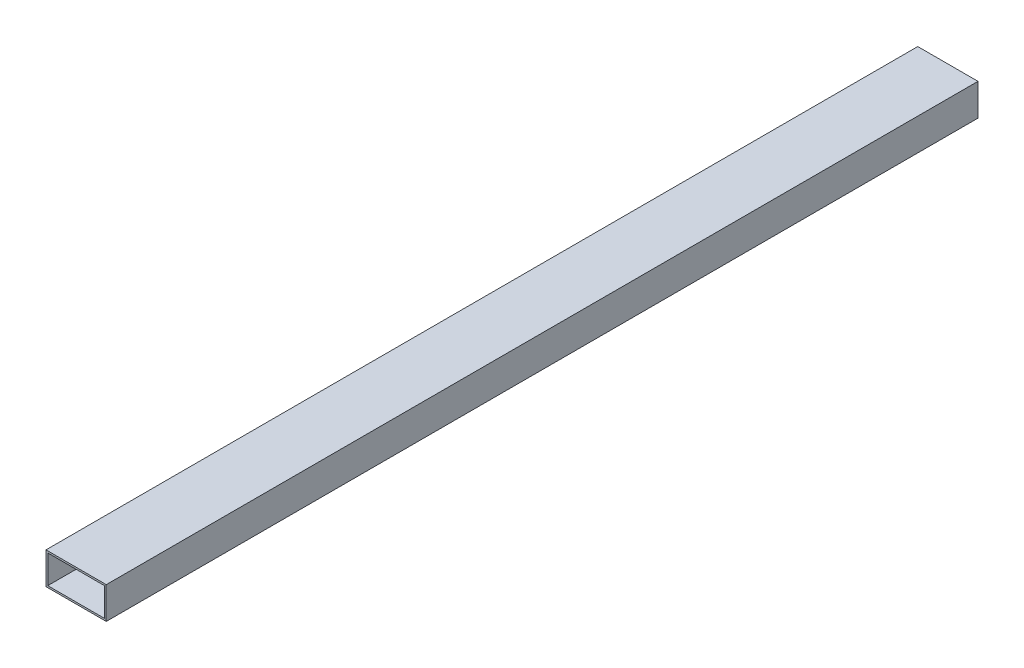
ISO-10303-21;
HEADER;
FILE_DESCRIPTION(('STEP AP214'),'2;1');
FILE_NAME('part.step','',(''),(''),'','','');
FILE_SCHEMA(('AUTOMOTIVE_DESIGN { 1 0 10303 214 1 1 1 1 }'));
ENDSEC;
DATA;
#1=APPLICATION_CONTEXT('core data for automotive mechanical design processes');
#2=APPLICATION_PROTOCOL_DEFINITION('international standard','automotive_design',2000,#1);
#3=PRODUCT_CONTEXT('',#1,'mechanical');
#4=PRODUCT('Part','Part','',(#3));
#5=PRODUCT_RELATED_PRODUCT_CATEGORY('part','',(#4));
#6=PRODUCT_DEFINITION_FORMATION('','',#4);
#7=PRODUCT_DEFINITION_CONTEXT('part definition',#1,'design');
#8=PRODUCT_DEFINITION('design','',#6,#7);
#9=PRODUCT_DEFINITION_SHAPE('','',#8);
#10=(LENGTH_UNIT() NAMED_UNIT(*) SI_UNIT(.MILLI.,.METRE.));
#11=(NAMED_UNIT(*) PLANE_ANGLE_UNIT() SI_UNIT($,.RADIAN.));
#12=(NAMED_UNIT(*) SI_UNIT($,.STERADIAN.) SOLID_ANGLE_UNIT());
#13=UNCERTAINTY_MEASURE_WITH_UNIT(LENGTH_MEASURE(1.E-05),#10,'distance_accuracy_value','');
#14=(GEOMETRIC_REPRESENTATION_CONTEXT(3) GLOBAL_UNCERTAINTY_ASSIGNED_CONTEXT((#13)) GLOBAL_UNIT_ASSIGNED_CONTEXT((#10,
#11,#12)) REPRESENTATION_CONTEXT('',''));
#15=CARTESIAN_POINT('',(0.,0.,0.));
#16=DIRECTION('',(0.,0.,1.));
#17=DIRECTION('',(1.,0.,0.));
#18=AXIS2_PLACEMENT_3D('',#15,#16,#17);
#19=CARTESIAN_POINT('',(0.,0.,781.05));
#20=DIRECTION('',(0.,0.,1.));
#21=DIRECTION('',(1.,0.,0.));
#22=AXIS2_PLACEMENT_3D('',#19,#20,#21);
#23=PLANE('',#22);
#24=DIRECTION('',(0.,1.,0.));
#25=VECTOR('',#24,1.);
#26=CARTESIAN_POINT('',(1.5875,0.,781.05));
#27=LINE('',#26,#25);
#28=CARTESIAN_POINT('',(1.5875,-26.9875,781.05));
#29=VERTEX_POINT('',#28);
#30=CARTESIAN_POINT('',(1.5875,1.5875,781.05));
#31=VERTEX_POINT('',#30);
#32=EDGE_CURVE('E158',#29,#31,#27,.T.);
#33=ORIENTED_EDGE('',*,*,#32,.T.);
#34=DIRECTION('',(-1.,0.,0.));
#35=VECTOR('',#34,1.);
#36=CARTESIAN_POINT('',(0.,1.5875,781.05));
#37=LINE('',#36,#35);
#38=CARTESIAN_POINT('',(-52.3875,1.5875,781.05));
#39=VERTEX_POINT('',#38);
#40=EDGE_CURVE('E161',#31,#39,#37,.T.);
#41=ORIENTED_EDGE('',*,*,#40,.T.);
#42=DIRECTION('',(0.,-1.,0.));
#43=VECTOR('',#42,1.);
#44=CARTESIAN_POINT('',(-52.3875,0.,781.05));
#45=LINE('',#44,#43);
#46=CARTESIAN_POINT('',(-52.3875,-26.9875,781.05));
#47=VERTEX_POINT('',#46);
#48=EDGE_CURVE('E164',#39,#47,#45,.T.);
#49=ORIENTED_EDGE('',*,*,#48,.T.);
#50=DIRECTION('',(1.,0.,0.));
#51=VECTOR('',#50,1.);
#52=CARTESIAN_POINT('',(0.,-26.9875,781.05));
#53=LINE('',#52,#51);
#54=EDGE_CURVE('E166',#47,#29,#53,.T.);
#55=ORIENTED_EDGE('',*,*,#54,.T.);
#56=EDGE_LOOP('',(#33,#41,#49,#55));
#57=FACE_BOUND('',#56,.T.);
#58=DIRECTION('',(-1.,0.,0.));
#59=VECTOR('',#58,1.);
#60=CARTESIAN_POINT('',(0.,0.,781.05));
#61=LINE('',#60,#59);
#62=CARTESIAN_POINT('',(0.,0.,781.05));
#63=VERTEX_POINT('',#62);
#64=CARTESIAN_POINT('',(-50.8,0.,781.05));
#65=VERTEX_POINT('',#64);
#66=EDGE_CURVE('E130',#63,#65,#61,.T.);
#67=ORIENTED_EDGE('',*,*,#66,.F.);
#68=DIRECTION('',(0.,1.,0.));
#69=VECTOR('',#68,1.);
#70=CARTESIAN_POINT('',(0.,0.,781.05));
#71=LINE('',#70,#69);
#72=CARTESIAN_POINT('',(0.,-25.4,781.05));
#73=VERTEX_POINT('',#72);
#74=EDGE_CURVE('E122',#73,#63,#71,.T.);
#75=ORIENTED_EDGE('',*,*,#74,.F.);
#76=DIRECTION('',(1.,0.,0.));
#77=VECTOR('',#76,1.);
#78=CARTESIAN_POINT('',(0.,-25.4,781.05));
#79=LINE('',#78,#77);
#80=CARTESIAN_POINT('',(-50.8,-25.4,781.05));
#81=VERTEX_POINT('',#80);
#82=EDGE_CURVE('E144',#81,#73,#79,.T.);
#83=ORIENTED_EDGE('',*,*,#82,.F.);
#84=DIRECTION('',(0.,-1.,0.));
#85=VECTOR('',#84,1.);
#86=CARTESIAN_POINT('',(-50.8,0.,781.05));
#87=LINE('',#86,#85);
#88=EDGE_CURVE('E142',#65,#81,#87,.T.);
#89=ORIENTED_EDGE('',*,*,#88,.F.);
#90=EDGE_LOOP('',(#67,#75,#83,#89));
#91=FACE_BOUND('',#90,.T.);
#92=ADVANCED_FACE('F57',(#57,#91),#23,.T.);
#93=CARTESIAN_POINT('',(0.,0.,0.));
#94=DIRECTION('',(0.,0.,1.));
#95=DIRECTION('',(1.,0.,0.));
#96=AXIS2_PLACEMENT_3D('',#93,#94,#95);
#97=PLANE('',#96);
#98=DIRECTION('',(0.,1.,0.));
#99=VECTOR('',#98,1.);
#100=CARTESIAN_POINT('',(1.5875,0.,0.));
#101=LINE('',#100,#99);
#102=CARTESIAN_POINT('',(1.5875,-26.9875,0.));
#103=VERTEX_POINT('',#102);
#104=CARTESIAN_POINT('',(1.5875,1.5875,0.));
#105=VERTEX_POINT('',#104);
#106=EDGE_CURVE('E138',#103,#105,#101,.T.);
#107=ORIENTED_EDGE('',*,*,#106,.F.);
#108=DIRECTION('',(1.,0.,0.));
#109=VECTOR('',#108,1.);
#110=CARTESIAN_POINT('',(0.,-26.9875,0.));
#111=LINE('',#110,#109);
#112=CARTESIAN_POINT('',(-52.3875,-26.9875,0.));
#113=VERTEX_POINT('',#112);
#114=EDGE_CURVE('E162',#113,#103,#111,.T.);
#115=ORIENTED_EDGE('',*,*,#114,.F.);
#116=DIRECTION('',(0.,-1.,0.));
#117=VECTOR('',#116,1.);
#118=CARTESIAN_POINT('',(-52.3875,0.,0.));
#119=LINE('',#118,#117);
#120=CARTESIAN_POINT('',(-52.3875,1.5875,0.));
#121=VERTEX_POINT('',#120);
#122=EDGE_CURVE('E173',#121,#113,#119,.T.);
#123=ORIENTED_EDGE('',*,*,#122,.F.);
#124=DIRECTION('',(-1.,0.,0.));
#125=VECTOR('',#124,1.);
#126=CARTESIAN_POINT('',(0.,1.5875,0.));
#127=LINE('',#126,#125);
#128=EDGE_CURVE('E171',#105,#121,#127,.T.);
#129=ORIENTED_EDGE('',*,*,#128,.F.);
#130=EDGE_LOOP('',(#107,#115,#123,#129));
#131=FACE_BOUND('',#130,.T.);
#132=DIRECTION('',(0.,1.,0.));
#133=VECTOR('',#132,1.);
#134=CARTESIAN_POINT('',(0.,0.,0.));
#135=LINE('',#134,#133);
#136=CARTESIAN_POINT('',(0.,-25.4,0.));
#137=VERTEX_POINT('',#136);
#138=CARTESIAN_POINT('',(0.,0.,0.));
#139=VERTEX_POINT('',#138);
#140=EDGE_CURVE('E80',#137,#139,#135,.T.);
#141=ORIENTED_EDGE('',*,*,#140,.T.);
#142=DIRECTION('',(-1.,0.,0.));
#143=VECTOR('',#142,1.);
#144=CARTESIAN_POINT('',(0.,0.,0.));
#145=LINE('',#144,#143);
#146=CARTESIAN_POINT('',(-50.8,0.,0.));
#147=VERTEX_POINT('',#146);
#148=EDGE_CURVE('E137',#139,#147,#145,.T.);
#149=ORIENTED_EDGE('',*,*,#148,.T.);
#150=DIRECTION('',(0.,-1.,0.));
#151=VECTOR('',#150,1.);
#152=CARTESIAN_POINT('',(-50.8,0.,0.));
#153=LINE('',#152,#151);
#154=CARTESIAN_POINT('',(-50.8,-25.4,0.));
#155=VERTEX_POINT('',#154);
#156=EDGE_CURVE('E150',#147,#155,#153,.T.);
#157=ORIENTED_EDGE('',*,*,#156,.T.);
#158=DIRECTION('',(1.,0.,0.));
#159=VECTOR('',#158,1.);
#160=CARTESIAN_POINT('',(0.,-25.4,0.));
#161=LINE('',#160,#159);
#162=EDGE_CURVE('E131',#155,#137,#161,.T.);
#163=ORIENTED_EDGE('',*,*,#162,.T.);
#164=EDGE_LOOP('',(#141,#149,#157,#163));
#165=FACE_BOUND('',#164,.T.);
#166=ADVANCED_FACE('F191',(#131,#165),#97,.F.);
#167=CARTESIAN_POINT('',(1.5875,0.,781.05));
#168=DIRECTION('',(-1.,0.,0.));
#169=DIRECTION('',(0.,-1.,0.));
#170=AXIS2_PLACEMENT_3D('',#167,#168,#169);
#171=PLANE('',#170);
#172=ORIENTED_EDGE('',*,*,#106,.T.);
#173=DIRECTION('',(0.,0.,-1.));
#174=VECTOR('',#173,1.);
#175=CARTESIAN_POINT('',(1.5875,1.5875,781.05));
#176=LINE('',#175,#174);
#177=EDGE_CURVE('E12',#31,#105,#176,.T.);
#178=ORIENTED_EDGE('',*,*,#177,.F.);
#179=ORIENTED_EDGE('',*,*,#32,.F.);
#180=DIRECTION('',(0.,0.,-1.));
#181=VECTOR('',#180,1.);
#182=CARTESIAN_POINT('',(1.5875,-26.9875,781.05));
#183=LINE('',#182,#181);
#184=EDGE_CURVE('E168',#29,#103,#183,.T.);
#185=ORIENTED_EDGE('',*,*,#184,.T.);
#186=EDGE_LOOP('',(#172,#178,#179,#185));
#187=FACE_BOUND('',#186,.T.);
#188=ADVANCED_FACE('F59',(#187),#171,.F.);
#189=CARTESIAN_POINT('',(0.,1.5875,781.05));
#190=DIRECTION('',(0.,-1.,0.));
#191=DIRECTION('',(0.,0.,-1.));
#192=AXIS2_PLACEMENT_3D('',#189,#190,#191);
#193=PLANE('',#192);
#194=ORIENTED_EDGE('',*,*,#128,.T.);
#195=DIRECTION('',(0.,0.,-1.));
#196=VECTOR('',#195,1.);
#197=CARTESIAN_POINT('',(-52.3875,1.5875,781.05));
#198=LINE('',#197,#196);
#199=EDGE_CURVE('E65',#39,#121,#198,.T.);
#200=ORIENTED_EDGE('',*,*,#199,.F.);
#201=ORIENTED_EDGE('',*,*,#40,.F.);
#202=ORIENTED_EDGE('',*,*,#177,.T.);
#203=EDGE_LOOP('',(#194,#200,#201,#202));
#204=FACE_BOUND('',#203,.T.);
#205=ADVANCED_FACE('F201',(#204),#193,.F.);
#206=CARTESIAN_POINT('',(-52.3875,0.,781.05));
#207=DIRECTION('',(1.,0.,0.));
#208=DIRECTION('',(0.,0.,-1.));
#209=AXIS2_PLACEMENT_3D('',#206,#207,#208);
#210=PLANE('',#209);
#211=ORIENTED_EDGE('',*,*,#122,.T.);
#212=DIRECTION('',(0.,0.,-1.));
#213=VECTOR('',#212,1.);
#214=CARTESIAN_POINT('',(-52.3875,-26.9875,781.05));
#215=LINE('',#214,#213);
#216=EDGE_CURVE('E178',#47,#113,#215,.T.);
#217=ORIENTED_EDGE('',*,*,#216,.F.);
#218=ORIENTED_EDGE('',*,*,#48,.F.);
#219=ORIENTED_EDGE('',*,*,#199,.T.);
#220=EDGE_LOOP('',(#211,#217,#218,#219));
#221=FACE_BOUND('',#220,.T.);
#222=ADVANCED_FACE('F185',(#221),#210,.F.);
#223=CARTESIAN_POINT('',(0.,-26.9875,781.05));
#224=DIRECTION('',(0.,1.,0.));
#225=DIRECTION('',(-1.,0.,0.));
#226=AXIS2_PLACEMENT_3D('',#223,#224,#225);
#227=PLANE('',#226);
#228=ORIENTED_EDGE('',*,*,#114,.T.);
#229=ORIENTED_EDGE('',*,*,#184,.F.);
#230=ORIENTED_EDGE('',*,*,#54,.F.);
#231=ORIENTED_EDGE('',*,*,#216,.T.);
#232=EDGE_LOOP('',(#228,#229,#230,#231));
#233=FACE_BOUND('',#232,.T.);
#234=ADVANCED_FACE('F195',(#233),#227,.F.);
#235=CARTESIAN_POINT('',(0.,0.,781.05));
#236=DIRECTION('',(-1.,0.,0.));
#237=DIRECTION('',(0.,-1.,0.));
#238=AXIS2_PLACEMENT_3D('',#235,#236,#237);
#239=PLANE('',#238);
#240=ORIENTED_EDGE('',*,*,#140,.F.);
#241=DIRECTION('',(0.,0.,-1.));
#242=VECTOR('',#241,1.);
#243=CARTESIAN_POINT('',(0.,-25.4,781.05));
#244=LINE('',#243,#242);
#245=EDGE_CURVE('E126',#73,#137,#244,.T.);
#246=ORIENTED_EDGE('',*,*,#245,.F.);
#247=ORIENTED_EDGE('',*,*,#74,.T.);
#248=DIRECTION('',(0.,0.,-1.));
#249=VECTOR('',#248,1.);
#250=CARTESIAN_POINT('',(0.,0.,781.05));
#251=LINE('',#250,#249);
#252=EDGE_CURVE('E125',#63,#139,#251,.T.);
#253=ORIENTED_EDGE('',*,*,#252,.T.);
#254=EDGE_LOOP('',(#240,#246,#247,#253));
#255=FACE_BOUND('',#254,.T.);
#256=ADVANCED_FACE('F124',(#255),#239,.T.);
#257=CARTESIAN_POINT('',(0.,0.,781.05));
#258=DIRECTION('',(0.,-1.,0.));
#259=DIRECTION('',(0.,0.,-1.));
#260=AXIS2_PLACEMENT_3D('',#257,#258,#259);
#261=PLANE('',#260);
#262=ORIENTED_EDGE('',*,*,#148,.F.);
#263=ORIENTED_EDGE('',*,*,#252,.F.);
#264=ORIENTED_EDGE('',*,*,#66,.T.);
#265=DIRECTION('',(0.,0.,-1.));
#266=VECTOR('',#265,1.);
#267=CARTESIAN_POINT('',(-50.8,0.,781.05));
#268=LINE('',#267,#266);
#269=EDGE_CURVE('E139',#65,#147,#268,.T.);
#270=ORIENTED_EDGE('',*,*,#269,.T.);
#271=EDGE_LOOP('',(#262,#263,#264,#270));
#272=FACE_BOUND('',#271,.T.);
#273=ADVANCED_FACE('F134',(#272),#261,.T.);
#274=CARTESIAN_POINT('',(-50.8,0.,781.05));
#275=DIRECTION('',(1.,0.,0.));
#276=DIRECTION('',(0.,0.,-1.));
#277=AXIS2_PLACEMENT_3D('',#274,#275,#276);
#278=PLANE('',#277);
#279=ORIENTED_EDGE('',*,*,#156,.F.);
#280=ORIENTED_EDGE('',*,*,#269,.F.);
#281=ORIENTED_EDGE('',*,*,#88,.T.);
#282=DIRECTION('',(0.,0.,-1.));
#283=VECTOR('',#282,1.);
#284=CARTESIAN_POINT('',(-50.8,-25.4,781.05));
#285=LINE('',#284,#283);
#286=EDGE_CURVE('E72',#81,#155,#285,.T.);
#287=ORIENTED_EDGE('',*,*,#286,.T.);
#288=EDGE_LOOP('',(#279,#280,#281,#287));
#289=FACE_BOUND('',#288,.T.);
#290=ADVANCED_FACE('F224',(#289),#278,.T.);
#291=CARTESIAN_POINT('',(0.,-25.4,781.05));
#292=DIRECTION('',(0.,1.,0.));
#293=DIRECTION('',(-1.,0.,0.));
#294=AXIS2_PLACEMENT_3D('',#291,#292,#293);
#295=PLANE('',#294);
#296=ORIENTED_EDGE('',*,*,#162,.F.);
#297=ORIENTED_EDGE('',*,*,#286,.F.);
#298=ORIENTED_EDGE('',*,*,#82,.T.);
#299=ORIENTED_EDGE('',*,*,#245,.T.);
#300=EDGE_LOOP('',(#296,#297,#298,#299));
#301=FACE_BOUND('',#300,.T.);
#302=ADVANCED_FACE('F228',(#301),#295,.T.);
#303=CLOSED_SHELL('',(#92,#166,#188,#205,#222,#234,#256,#273,#290,#302));
#304=MANIFOLD_SOLID_BREP('B2',#303);
#305=ADVANCED_BREP_SHAPE_REPRESENTATION('',(#18,#304),#14);
#306=SHAPE_DEFINITION_REPRESENTATION(#9,#305);
ENDSEC;
END-ISO-10303-21;
